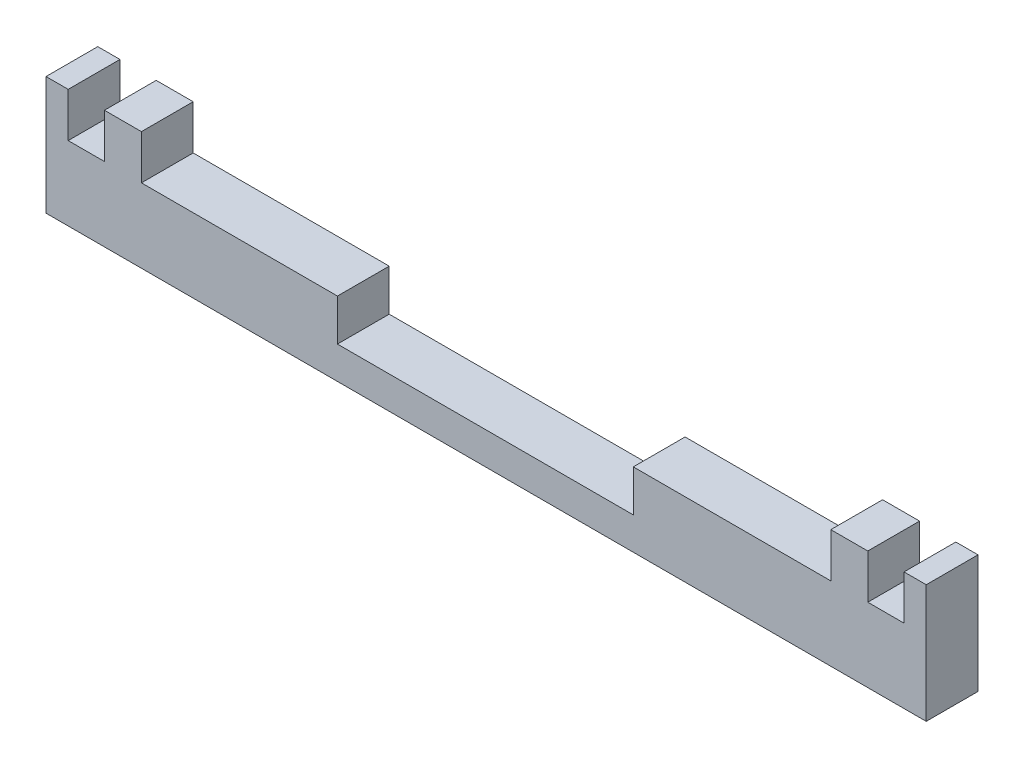
ISO-10303-21;
HEADER;
FILE_DESCRIPTION(('STEP AP214'),'2;1');
FILE_NAME('part.step','',(''),(''),'','','');
FILE_SCHEMA(('AUTOMOTIVE_DESIGN { 1 0 10303 214 1 1 1 1 }'));
ENDSEC;
DATA;
#1=APPLICATION_CONTEXT('core data for automotive mechanical design processes');
#2=APPLICATION_PROTOCOL_DEFINITION('international standard','automotive_design',2000,#1);
#3=PRODUCT_CONTEXT('',#1,'mechanical');
#4=PRODUCT('Part','Part','',(#3));
#5=PRODUCT_RELATED_PRODUCT_CATEGORY('part','',(#4));
#6=PRODUCT_DEFINITION_FORMATION('','',#4);
#7=PRODUCT_DEFINITION_CONTEXT('part definition',#1,'design');
#8=PRODUCT_DEFINITION('design','',#6,#7);
#9=PRODUCT_DEFINITION_SHAPE('','',#8);
#10=(LENGTH_UNIT() NAMED_UNIT(*) SI_UNIT(.MILLI.,.METRE.));
#11=(NAMED_UNIT(*) PLANE_ANGLE_UNIT() SI_UNIT($,.RADIAN.));
#12=(NAMED_UNIT(*) SI_UNIT($,.STERADIAN.) SOLID_ANGLE_UNIT());
#13=UNCERTAINTY_MEASURE_WITH_UNIT(LENGTH_MEASURE(1.E-05),#10,'distance_accuracy_value','');
#14=(GEOMETRIC_REPRESENTATION_CONTEXT(3) GLOBAL_UNCERTAINTY_ASSIGNED_CONTEXT((#13)) GLOBAL_UNIT_ASSIGNED_CONTEXT((#10,
#11,#12)) REPRESENTATION_CONTEXT('',''));
#15=CARTESIAN_POINT('',(0.,0.,0.));
#16=DIRECTION('',(0.,0.,1.));
#17=DIRECTION('',(1.,0.,0.));
#18=AXIS2_PLACEMENT_3D('',#15,#16,#17);
#19=CARTESIAN_POINT('',(39.2998382428941,-10.997149870801,8.89));
#20=DIRECTION('',(0.,-1.,0.));
#21=DIRECTION('',(1.,0.,0.));
#22=AXIS2_PLACEMENT_3D('',#19,#20,#21);
#23=PLANE('',#22);
#24=DIRECTION('',(-1.,0.,0.));
#25=VECTOR('',#24,1.);
#26=CARTESIAN_POINT('',(39.2998382428941,-10.997149870801,8.89));
#27=LINE('',#26,#25);
#28=CARTESIAN_POINT('',(-45.4091617571059,-10.997149870801,8.89));
#29=VERTEX_POINT('',#28);
#30=CARTESIAN_POINT('',(-79.0641617571059,-10.997149870801,8.89));
#31=VERTEX_POINT('',#30);
#32=EDGE_CURVE('E297',#29,#31,#27,.T.);
#33=ORIENTED_EDGE('',*,*,#32,.F.);
#34=DIRECTION('',(0.,0.,1.));
#35=VECTOR('',#34,1.);
#36=CARTESIAN_POINT('',(-45.4091617571059,-10.997149870801,0.));
#37=LINE('',#36,#35);
#38=CARTESIAN_POINT('',(-45.4091617571059,-10.997149870801,0.));
#39=VERTEX_POINT('',#38);
#40=EDGE_CURVE('E197',#39,#29,#37,.T.);
#41=ORIENTED_EDGE('',*,*,#40,.F.);
#42=DIRECTION('',(-1.,0.,0.));
#43=VECTOR('',#42,1.);
#44=CARTESIAN_POINT('',(39.2998382428941,-10.997149870801,0.));
#45=LINE('',#44,#43);
#46=CARTESIAN_POINT('',(-79.0641617571059,-10.997149870801,0.));
#47=VERTEX_POINT('',#46);
#48=EDGE_CURVE('E213',#39,#47,#45,.T.);
#49=ORIENTED_EDGE('',*,*,#48,.T.);
#50=DIRECTION('',(0.,0.,-1.));
#51=VECTOR('',#50,1.);
#52=CARTESIAN_POINT('',(-79.0641617571059,-10.997149870801,8.89));
#53=LINE('',#52,#51);
#54=EDGE_CURVE('E237',#31,#47,#53,.T.);
#55=ORIENTED_EDGE('',*,*,#54,.F.);
#56=EDGE_LOOP('',(#33,#41,#49,#55));
#57=FACE_BOUND('',#56,.T.);
#58=ADVANCED_FACE('F35',(#57),#23,.F.);
#59=CARTESIAN_POINT('',(-95.4471617571059,-3.37714987080102,8.89));
#60=DIRECTION('',(1.,0.,0.));
#61=DIRECTION('',(0.,0.,-1.));
#62=AXIS2_PLACEMENT_3D('',#59,#60,#61);
#63=PLANE('',#62);
#64=DIRECTION('',(0.,-1.,0.));
#65=VECTOR('',#64,1.);
#66=CARTESIAN_POINT('',(-95.4471617571059,-3.37714987080102,0.));
#67=LINE('',#66,#65);
#68=CARTESIAN_POINT('',(-95.4471617571059,-3.37714987080102,0.));
#69=VERTEX_POINT('',#68);
#70=CARTESIAN_POINT('',(-95.4471617571059,-23.697149870801,0.));
#71=VERTEX_POINT('',#70);
#72=EDGE_CURVE('E193',#69,#71,#67,.T.);
#73=ORIENTED_EDGE('',*,*,#72,.T.);
#74=DIRECTION('',(0.,0.,-1.));
#75=VECTOR('',#74,1.);
#76=CARTESIAN_POINT('',(-95.4471617571059,-23.697149870801,8.89));
#77=LINE('',#76,#75);
#78=CARTESIAN_POINT('',(-95.4471617571059,-23.697149870801,8.89));
#79=VERTEX_POINT('',#78);
#80=EDGE_CURVE('E11',#79,#71,#77,.T.);
#81=ORIENTED_EDGE('',*,*,#80,.F.);
#82=DIRECTION('',(0.,-1.,0.));
#83=VECTOR('',#82,1.);
#84=CARTESIAN_POINT('',(-95.4471617571059,-3.37714987080102,8.89));
#85=LINE('',#84,#83);
#86=CARTESIAN_POINT('',(-95.4471617571059,-3.37714987080102,8.89));
#87=VERTEX_POINT('',#86);
#88=EDGE_CURVE('E227',#87,#79,#85,.T.);
#89=ORIENTED_EDGE('',*,*,#88,.F.);
#90=DIRECTION('',(0.,0.,-1.));
#91=VECTOR('',#90,1.);
#92=CARTESIAN_POINT('',(-95.4471617571059,-3.37714987080102,8.89));
#93=LINE('',#92,#91);
#94=EDGE_CURVE('E189',#87,#69,#93,.T.);
#95=ORIENTED_EDGE('',*,*,#94,.T.);
#96=EDGE_LOOP('',(#73,#81,#89,#95));
#97=FACE_BOUND('',#96,.T.);
#98=ADVANCED_FACE('F37',(#97),#63,.F.);
#99=CARTESIAN_POINT('',(-95.4471617571059,-23.697149870801,8.89));
#100=DIRECTION('',(0.,1.,0.));
#101=DIRECTION('',(0.,0.,1.));
#102=AXIS2_PLACEMENT_3D('',#99,#100,#101);
#103=PLANE('',#102);
#104=DIRECTION('',(1.,0.,0.));
#105=VECTOR('',#104,1.);
#106=CARTESIAN_POINT('',(-95.4471617571059,-23.697149870801,0.));
#107=LINE('',#106,#105);
#108=CARTESIAN_POINT('',(55.6828382428941,-23.697149870801,0.));
#109=VERTEX_POINT('',#108);
#110=EDGE_CURVE('E196',#71,#109,#107,.T.);
#111=ORIENTED_EDGE('',*,*,#110,.T.);
#112=DIRECTION('',(0.,0.,-1.));
#113=VECTOR('',#112,1.);
#114=CARTESIAN_POINT('',(55.6828382428941,-23.697149870801,8.89));
#115=LINE('',#114,#113);
#116=CARTESIAN_POINT('',(55.6828382428941,-23.697149870801,8.89));
#117=VERTEX_POINT('',#116);
#118=EDGE_CURVE('E43',#117,#109,#115,.T.);
#119=ORIENTED_EDGE('',*,*,#118,.F.);
#120=DIRECTION('',(1.,0.,0.));
#121=VECTOR('',#120,1.);
#122=CARTESIAN_POINT('',(-95.4471617571059,-23.697149870801,8.89));
#123=LINE('',#122,#121);
#124=EDGE_CURVE('E124',#79,#117,#123,.T.);
#125=ORIENTED_EDGE('',*,*,#124,.F.);
#126=ORIENTED_EDGE('',*,*,#80,.T.);
#127=EDGE_LOOP('',(#111,#119,#125,#126));
#128=FACE_BOUND('',#127,.T.);
#129=ADVANCED_FACE('F405',(#128),#103,.F.);
#130=CARTESIAN_POINT('',(55.6828382428941,-23.697149870801,8.89));
#131=DIRECTION('',(-1.,0.,0.));
#132=DIRECTION('',(0.,-1.,0.));
#133=AXIS2_PLACEMENT_3D('',#130,#131,#132);
#134=PLANE('',#133);
#135=DIRECTION('',(0.,1.,0.));
#136=VECTOR('',#135,1.);
#137=CARTESIAN_POINT('',(55.6828382428941,-23.697149870801,0.));
#138=LINE('',#137,#136);
#139=CARTESIAN_POINT('',(55.6828382428941,-3.377149870801,0.));
#140=VERTEX_POINT('',#139);
#141=EDGE_CURVE('E199',#109,#140,#138,.T.);
#142=ORIENTED_EDGE('',*,*,#141,.T.);
#143=DIRECTION('',(0.,0.,-1.));
#144=VECTOR('',#143,1.);
#145=CARTESIAN_POINT('',(55.6828382428941,-3.377149870801,8.89));
#146=LINE('',#145,#144);
#147=CARTESIAN_POINT('',(55.6828382428941,-3.377149870801,8.89));
#148=VERTEX_POINT('',#147);
#149=EDGE_CURVE('E258',#148,#140,#146,.T.);
#150=ORIENTED_EDGE('',*,*,#149,.F.);
#151=DIRECTION('',(0.,1.,0.));
#152=VECTOR('',#151,1.);
#153=CARTESIAN_POINT('',(55.6828382428941,-23.697149870801,8.89));
#154=LINE('',#153,#152);
#155=EDGE_CURVE('E266',#117,#148,#154,.T.);
#156=ORIENTED_EDGE('',*,*,#155,.F.);
#157=ORIENTED_EDGE('',*,*,#118,.T.);
#158=EDGE_LOOP('',(#142,#150,#156,#157));
#159=FACE_BOUND('',#158,.T.);
#160=ADVANCED_FACE('F264',(#159),#134,.F.);
#161=CARTESIAN_POINT('',(55.6828382428941,-3.377149870801,8.89));
#162=DIRECTION('',(0.,-1.,0.));
#163=DIRECTION('',(1.,0.,0.));
#164=AXIS2_PLACEMENT_3D('',#161,#162,#163);
#165=PLANE('',#164);
#166=DIRECTION('',(-1.,0.,0.));
#167=VECTOR('',#166,1.);
#168=CARTESIAN_POINT('',(55.6828382428941,-3.377149870801,0.));
#169=LINE('',#168,#167);
#170=CARTESIAN_POINT('',(51.8728382428941,-3.377149870801,0.));
#171=VERTEX_POINT('',#170);
#172=EDGE_CURVE('E201',#140,#171,#169,.T.);
#173=ORIENTED_EDGE('',*,*,#172,.T.);
#174=DIRECTION('',(0.,0.,-1.));
#175=VECTOR('',#174,1.);
#176=CARTESIAN_POINT('',(51.8728382428941,-3.377149870801,8.89));
#177=LINE('',#176,#175);
#178=CARTESIAN_POINT('',(51.8728382428941,-3.377149870801,8.89));
#179=VERTEX_POINT('',#178);
#180=EDGE_CURVE('E255',#179,#171,#177,.T.);
#181=ORIENTED_EDGE('',*,*,#180,.F.);
#182=DIRECTION('',(-1.,0.,0.));
#183=VECTOR('',#182,1.);
#184=CARTESIAN_POINT('',(55.6828382428941,-3.377149870801,8.89));
#185=LINE('',#184,#183);
#186=EDGE_CURVE('E285',#148,#179,#185,.T.);
#187=ORIENTED_EDGE('',*,*,#186,.F.);
#188=ORIENTED_EDGE('',*,*,#149,.T.);
#189=EDGE_LOOP('',(#173,#181,#187,#188));
#190=FACE_BOUND('',#189,.T.);
#191=ADVANCED_FACE('F276',(#190),#165,.F.);
#192=CARTESIAN_POINT('',(51.8728382428941,-3.377149870801,8.89));
#193=DIRECTION('',(1.,0.,0.));
#194=DIRECTION('',(0.,1.,0.));
#195=AXIS2_PLACEMENT_3D('',#192,#193,#194);
#196=PLANE('',#195);
#197=DIRECTION('',(0.,-1.,0.));
#198=VECTOR('',#197,1.);
#199=CARTESIAN_POINT('',(51.8728382428941,-3.377149870801,0.));
#200=LINE('',#199,#198);
#201=CARTESIAN_POINT('',(51.872838242894,-10.997149870801,0.));
#202=VERTEX_POINT('',#201);
#203=EDGE_CURVE('E203',#171,#202,#200,.T.);
#204=ORIENTED_EDGE('',*,*,#203,.T.);
#205=DIRECTION('',(0.,0.,-1.));
#206=VECTOR('',#205,1.);
#207=CARTESIAN_POINT('',(51.872838242894,-10.997149870801,8.89));
#208=LINE('',#207,#206);
#209=CARTESIAN_POINT('',(51.872838242894,-10.997149870801,8.89));
#210=VERTEX_POINT('',#209);
#211=EDGE_CURVE('E252',#210,#202,#208,.T.);
#212=ORIENTED_EDGE('',*,*,#211,.F.);
#213=DIRECTION('',(0.,-1.,0.));
#214=VECTOR('',#213,1.);
#215=CARTESIAN_POINT('',(51.8728382428941,-3.377149870801,8.89));
#216=LINE('',#215,#214);
#217=EDGE_CURVE('E282',#179,#210,#216,.T.);
#218=ORIENTED_EDGE('',*,*,#217,.F.);
#219=ORIENTED_EDGE('',*,*,#180,.T.);
#220=EDGE_LOOP('',(#204,#212,#218,#219));
#221=FACE_BOUND('',#220,.T.);
#222=ADVANCED_FACE('F280',(#221),#196,.F.);
#223=CARTESIAN_POINT('',(51.872838242894,-10.997149870801,8.89));
#224=DIRECTION('',(0.,-1.,0.));
#225=DIRECTION('',(1.,0.,0.));
#226=AXIS2_PLACEMENT_3D('',#223,#224,#225);
#227=PLANE('',#226);
#228=DIRECTION('',(-1.,0.,0.));
#229=VECTOR('',#228,1.);
#230=CARTESIAN_POINT('',(51.872838242894,-10.997149870801,0.));
#231=LINE('',#230,#229);
#232=CARTESIAN_POINT('',(45.6498382428941,-10.997149870801,0.));
#233=VERTEX_POINT('',#232);
#234=EDGE_CURVE('E205',#202,#233,#231,.T.);
#235=ORIENTED_EDGE('',*,*,#234,.T.);
#236=DIRECTION('',(0.,0.,-1.));
#237=VECTOR('',#236,1.);
#238=CARTESIAN_POINT('',(45.6498382428941,-10.997149870801,8.89));
#239=LINE('',#238,#237);
#240=CARTESIAN_POINT('',(45.6498382428941,-10.997149870801,8.89));
#241=VERTEX_POINT('',#240);
#242=EDGE_CURVE('E249',#241,#233,#239,.T.);
#243=ORIENTED_EDGE('',*,*,#242,.F.);
#244=DIRECTION('',(-1.,0.,0.));
#245=VECTOR('',#244,1.);
#246=CARTESIAN_POINT('',(51.872838242894,-10.997149870801,8.89));
#247=LINE('',#246,#245);
#248=EDGE_CURVE('E284',#210,#241,#247,.T.);
#249=ORIENTED_EDGE('',*,*,#248,.F.);
#250=ORIENTED_EDGE('',*,*,#211,.T.);
#251=EDGE_LOOP('',(#235,#243,#249,#250));
#252=FACE_BOUND('',#251,.T.);
#253=ADVANCED_FACE('F391',(#252),#227,.F.);
#254=CARTESIAN_POINT('',(45.6498382428941,-10.997149870801,8.89));
#255=DIRECTION('',(-1.,0.,0.));
#256=DIRECTION('',(0.,0.,1.));
#257=AXIS2_PLACEMENT_3D('',#254,#255,#256);
#258=PLANE('',#257);
#259=DIRECTION('',(0.,1.,0.));
#260=VECTOR('',#259,1.);
#261=CARTESIAN_POINT('',(45.6498382428941,-10.997149870801,0.));
#262=LINE('',#261,#260);
#263=CARTESIAN_POINT('',(45.6498382428941,-3.377149870801,0.));
#264=VERTEX_POINT('',#263);
#265=EDGE_CURVE('E207',#233,#264,#262,.T.);
#266=ORIENTED_EDGE('',*,*,#265,.T.);
#267=DIRECTION('',(0.,0.,-1.));
#268=VECTOR('',#267,1.);
#269=CARTESIAN_POINT('',(45.6498382428941,-3.377149870801,8.89));
#270=LINE('',#269,#268);
#271=CARTESIAN_POINT('',(45.6498382428941,-3.377149870801,8.89));
#272=VERTEX_POINT('',#271);
#273=EDGE_CURVE('E246',#272,#264,#270,.T.);
#274=ORIENTED_EDGE('',*,*,#273,.F.);
#275=DIRECTION('',(0.,1.,0.));
#276=VECTOR('',#275,1.);
#277=CARTESIAN_POINT('',(45.6498382428941,-10.997149870801,8.89));
#278=LINE('',#277,#276);
#279=EDGE_CURVE('E287',#241,#272,#278,.T.);
#280=ORIENTED_EDGE('',*,*,#279,.F.);
#281=ORIENTED_EDGE('',*,*,#242,.T.);
#282=EDGE_LOOP('',(#266,#274,#280,#281));
#283=FACE_BOUND('',#282,.T.);
#284=ADVANCED_FACE('F388',(#283),#258,.F.);
#285=CARTESIAN_POINT('',(45.6498382428941,-3.377149870801,8.89));
#286=DIRECTION('',(0.,-1.,0.));
#287=DIRECTION('',(1.,0.,0.));
#288=AXIS2_PLACEMENT_3D('',#285,#286,#287);
#289=PLANE('',#288);
#290=DIRECTION('',(-1.,0.,0.));
#291=VECTOR('',#290,1.);
#292=CARTESIAN_POINT('',(45.6498382428941,-3.377149870801,0.));
#293=LINE('',#292,#291);
#294=CARTESIAN_POINT('',(39.2998382428941,-3.377149870801,0.));
#295=VERTEX_POINT('',#294);
#296=EDGE_CURVE('E209',#264,#295,#293,.T.);
#297=ORIENTED_EDGE('',*,*,#296,.T.);
#298=DIRECTION('',(0.,0.,-1.));
#299=VECTOR('',#298,1.);
#300=CARTESIAN_POINT('',(39.2998382428941,-3.377149870801,8.89));
#301=LINE('',#300,#299);
#302=CARTESIAN_POINT('',(39.2998382428941,-3.377149870801,8.89));
#303=VERTEX_POINT('',#302);
#304=EDGE_CURVE('E243',#303,#295,#301,.T.);
#305=ORIENTED_EDGE('',*,*,#304,.F.);
#306=DIRECTION('',(-1.,0.,0.));
#307=VECTOR('',#306,1.);
#308=CARTESIAN_POINT('',(45.6498382428941,-3.377149870801,8.89));
#309=LINE('',#308,#307);
#310=EDGE_CURVE('E293',#272,#303,#309,.T.);
#311=ORIENTED_EDGE('',*,*,#310,.F.);
#312=ORIENTED_EDGE('',*,*,#273,.T.);
#313=EDGE_LOOP('',(#297,#305,#311,#312));
#314=FACE_BOUND('',#313,.T.);
#315=ADVANCED_FACE('F384',(#314),#289,.F.);
#316=CARTESIAN_POINT('',(39.2998382428941,-3.377149870801,8.89));
#317=DIRECTION('',(1.,0.,0.));
#318=DIRECTION('',(0.,0.,-1.));
#319=AXIS2_PLACEMENT_3D('',#316,#317,#318);
#320=PLANE('',#319);
#321=DIRECTION('',(0.,-1.,0.));
#322=VECTOR('',#321,1.);
#323=CARTESIAN_POINT('',(39.2998382428941,-3.377149870801,0.));
#324=LINE('',#323,#322);
#325=CARTESIAN_POINT('',(39.2998382428941,-10.997149870801,0.));
#326=VERTEX_POINT('',#325);
#327=EDGE_CURVE('E211',#295,#326,#324,.T.);
#328=ORIENTED_EDGE('',*,*,#327,.T.);
#329=DIRECTION('',(0.,0.,-1.));
#330=VECTOR('',#329,1.);
#331=CARTESIAN_POINT('',(39.2998382428941,-10.997149870801,8.89));
#332=LINE('',#331,#330);
#333=CARTESIAN_POINT('',(39.2998382428941,-10.997149870801,8.89));
#334=VERTEX_POINT('',#333);
#335=EDGE_CURVE('E240',#334,#326,#332,.T.);
#336=ORIENTED_EDGE('',*,*,#335,.F.);
#337=DIRECTION('',(0.,-1.,0.));
#338=VECTOR('',#337,1.);
#339=CARTESIAN_POINT('',(39.2998382428941,-3.377149870801,8.89));
#340=LINE('',#339,#338);
#341=EDGE_CURVE('E295',#303,#334,#340,.T.);
#342=ORIENTED_EDGE('',*,*,#341,.F.);
#343=ORIENTED_EDGE('',*,*,#304,.T.);
#344=EDGE_LOOP('',(#328,#336,#342,#343));
#345=FACE_BOUND('',#344,.T.);
#346=ADVANCED_FACE('F379',(#345),#320,.F.);
#347=CARTESIAN_POINT('',(5.39083824289407,-10.997149870801,0.));
#348=VERTEX_POINT('',#347);
#349=EDGE_CURVE('E214',#326,#348,#45,.T.);
#350=ORIENTED_EDGE('',*,*,#349,.T.);
#351=DIRECTION('',(0.,0.,1.));
#352=VECTOR('',#351,1.);
#353=CARTESIAN_POINT('',(5.39083824289407,-10.997149870801,0.));
#354=LINE('',#353,#352);
#355=CARTESIAN_POINT('',(5.39083824289407,-10.997149870801,8.89));
#356=VERTEX_POINT('',#355);
#357=EDGE_CURVE('E326',#348,#356,#354,.T.);
#358=ORIENTED_EDGE('',*,*,#357,.T.);
#359=EDGE_CURVE('E298',#334,#356,#27,.T.);
#360=ORIENTED_EDGE('',*,*,#359,.F.);
#361=ORIENTED_EDGE('',*,*,#335,.T.);
#362=EDGE_LOOP('',(#350,#358,#360,#361));
#363=FACE_BOUND('',#362,.T.);
#364=ADVANCED_FACE('F372',(#363),#23,.F.);
#365=CARTESIAN_POINT('',(-79.0641617571059,-10.997149870801,8.89));
#366=DIRECTION('',(-1.,0.,0.));
#367=DIRECTION('',(0.,0.,1.));
#368=AXIS2_PLACEMENT_3D('',#365,#366,#367);
#369=PLANE('',#368);
#370=DIRECTION('',(0.,1.,0.));
#371=VECTOR('',#370,1.);
#372=CARTESIAN_POINT('',(-79.0641617571059,-10.997149870801,0.));
#373=LINE('',#372,#371);
#374=CARTESIAN_POINT('',(-79.0641617571059,-3.37714987080101,0.));
#375=VERTEX_POINT('',#374);
#376=EDGE_CURVE('E217',#47,#375,#373,.T.);
#377=ORIENTED_EDGE('',*,*,#376,.T.);
#378=DIRECTION('',(0.,0.,-1.));
#379=VECTOR('',#378,1.);
#380=CARTESIAN_POINT('',(-79.0641617571059,-3.37714987080101,8.89));
#381=LINE('',#380,#379);
#382=CARTESIAN_POINT('',(-79.0641617571059,-3.37714987080101,8.89));
#383=VERTEX_POINT('',#382);
#384=EDGE_CURVE('E234',#383,#375,#381,.T.);
#385=ORIENTED_EDGE('',*,*,#384,.F.);
#386=DIRECTION('',(0.,1.,0.));
#387=VECTOR('',#386,1.);
#388=CARTESIAN_POINT('',(-79.0641617571059,-10.997149870801,8.89));
#389=LINE('',#388,#387);
#390=EDGE_CURVE('E301',#31,#383,#389,.T.);
#391=ORIENTED_EDGE('',*,*,#390,.F.);
#392=ORIENTED_EDGE('',*,*,#54,.T.);
#393=EDGE_LOOP('',(#377,#385,#391,#392));
#394=FACE_BOUND('',#393,.T.);
#395=ADVANCED_FACE('F409',(#394),#369,.F.);
#396=CARTESIAN_POINT('',(-79.0641617571059,-3.37714987080101,8.89));
#397=DIRECTION('',(0.,-1.,0.));
#398=DIRECTION('',(1.,0.,0.));
#399=AXIS2_PLACEMENT_3D('',#396,#397,#398);
#400=PLANE('',#399);
#401=DIRECTION('',(-1.,0.,0.));
#402=VECTOR('',#401,1.);
#403=CARTESIAN_POINT('',(-79.0641617571059,-3.37714987080101,0.));
#404=LINE('',#403,#402);
#405=CARTESIAN_POINT('',(-85.4141617571059,-3.37714987080101,0.));
#406=VERTEX_POINT('',#405);
#407=EDGE_CURVE('E219',#375,#406,#404,.T.);
#408=ORIENTED_EDGE('',*,*,#407,.T.);
#409=DIRECTION('',(0.,0.,-1.));
#410=VECTOR('',#409,1.);
#411=CARTESIAN_POINT('',(-85.4141617571059,-3.37714987080101,8.89));
#412=LINE('',#411,#410);
#413=CARTESIAN_POINT('',(-85.4141617571059,-3.37714987080101,8.89));
#414=VERTEX_POINT('',#413);
#415=EDGE_CURVE('E231',#414,#406,#412,.T.);
#416=ORIENTED_EDGE('',*,*,#415,.F.);
#417=DIRECTION('',(-1.,0.,0.));
#418=VECTOR('',#417,1.);
#419=CARTESIAN_POINT('',(-79.0641617571059,-3.37714987080101,8.89));
#420=LINE('',#419,#418);
#421=EDGE_CURVE('E303',#383,#414,#420,.T.);
#422=ORIENTED_EDGE('',*,*,#421,.F.);
#423=ORIENTED_EDGE('',*,*,#384,.T.);
#424=EDGE_LOOP('',(#408,#416,#422,#423));
#425=FACE_BOUND('',#424,.T.);
#426=ADVANCED_FACE('F309',(#425),#400,.F.);
#427=CARTESIAN_POINT('',(-85.4141617571059,-3.37714987080101,8.89));
#428=DIRECTION('',(1.,0.,0.));
#429=DIRECTION('',(0.,0.,-1.));
#430=AXIS2_PLACEMENT_3D('',#427,#428,#429);
#431=PLANE('',#430);
#432=DIRECTION('',(0.,-1.,0.));
#433=VECTOR('',#432,1.);
#434=CARTESIAN_POINT('',(-85.4141617571059,-3.37714987080101,0.));
#435=LINE('',#434,#433);
#436=CARTESIAN_POINT('',(-85.4141617571059,-10.997149870801,0.));
#437=VERTEX_POINT('',#436);
#438=EDGE_CURVE('E221',#406,#437,#435,.T.);
#439=ORIENTED_EDGE('',*,*,#438,.T.);
#440=DIRECTION('',(0.,0.,-1.));
#441=VECTOR('',#440,1.);
#442=CARTESIAN_POINT('',(-85.4141617571059,-10.997149870801,8.89));
#443=LINE('',#442,#441);
#444=CARTESIAN_POINT('',(-85.4141617571059,-10.997149870801,8.89));
#445=VERTEX_POINT('',#444);
#446=EDGE_CURVE('E184',#445,#437,#443,.T.);
#447=ORIENTED_EDGE('',*,*,#446,.F.);
#448=DIRECTION('',(0.,-1.,0.));
#449=VECTOR('',#448,1.);
#450=CARTESIAN_POINT('',(-85.4141617571059,-3.37714987080101,8.89));
#451=LINE('',#450,#449);
#452=EDGE_CURVE('E172',#414,#445,#451,.T.);
#453=ORIENTED_EDGE('',*,*,#452,.F.);
#454=ORIENTED_EDGE('',*,*,#415,.T.);
#455=EDGE_LOOP('',(#439,#447,#453,#454));
#456=FACE_BOUND('',#455,.T.);
#457=ADVANCED_FACE('F313',(#456),#431,.F.);
#458=CARTESIAN_POINT('',(-85.4141617571059,-10.997149870801,8.89));
#459=DIRECTION('',(0.,-1.,0.));
#460=DIRECTION('',(1.,0.,0.));
#461=AXIS2_PLACEMENT_3D('',#458,#459,#460);
#462=PLANE('',#461);
#463=DIRECTION('',(-1.,0.,0.));
#464=VECTOR('',#463,1.);
#465=CARTESIAN_POINT('',(-85.4141617571059,-10.997149870801,0.));
#466=LINE('',#465,#464);
#467=CARTESIAN_POINT('',(-91.6371617571059,-10.997149870801,0.));
#468=VERTEX_POINT('',#467);
#469=EDGE_CURVE('E181',#437,#468,#466,.T.);
#470=ORIENTED_EDGE('',*,*,#469,.T.);
#471=DIRECTION('',(0.,0.,-1.));
#472=VECTOR('',#471,1.);
#473=CARTESIAN_POINT('',(-91.6371617571059,-10.997149870801,8.89));
#474=LINE('',#473,#472);
#475=CARTESIAN_POINT('',(-91.6371617571059,-10.997149870801,8.89));
#476=VERTEX_POINT('',#475);
#477=EDGE_CURVE('E178',#476,#468,#474,.T.);
#478=ORIENTED_EDGE('',*,*,#477,.F.);
#479=DIRECTION('',(-1.,0.,0.));
#480=VECTOR('',#479,1.);
#481=CARTESIAN_POINT('',(-85.4141617571059,-10.997149870801,8.89));
#482=LINE('',#481,#480);
#483=EDGE_CURVE('E164',#445,#476,#482,.T.);
#484=ORIENTED_EDGE('',*,*,#483,.F.);
#485=ORIENTED_EDGE('',*,*,#446,.T.);
#486=EDGE_LOOP('',(#470,#478,#484,#485));
#487=FACE_BOUND('',#486,.T.);
#488=ADVANCED_FACE('F179',(#487),#462,.F.);
#489=CARTESIAN_POINT('',(-91.6371617571059,-10.997149870801,8.89));
#490=DIRECTION('',(-1.,0.,0.));
#491=DIRECTION('',(0.,0.,1.));
#492=AXIS2_PLACEMENT_3D('',#489,#490,#491);
#493=PLANE('',#492);
#494=DIRECTION('',(0.,1.,0.));
#495=VECTOR('',#494,1.);
#496=CARTESIAN_POINT('',(-91.6371617571059,-10.997149870801,0.));
#497=LINE('',#496,#495);
#498=CARTESIAN_POINT('',(-91.6371617571059,-3.37714987080101,0.));
#499=VERTEX_POINT('',#498);
#500=EDGE_CURVE('E224',#468,#499,#497,.T.);
#501=ORIENTED_EDGE('',*,*,#500,.T.);
#502=DIRECTION('',(0.,0.,-1.));
#503=VECTOR('',#502,1.);
#504=CARTESIAN_POINT('',(-91.6371617571059,-3.37714987080101,8.89));
#505=LINE('',#504,#503);
#506=CARTESIAN_POINT('',(-91.6371617571059,-3.37714987080101,8.89));
#507=VERTEX_POINT('',#506);
#508=EDGE_CURVE('E185',#507,#499,#505,.T.);
#509=ORIENTED_EDGE('',*,*,#508,.F.);
#510=DIRECTION('',(0.,1.,0.));
#511=VECTOR('',#510,1.);
#512=CARTESIAN_POINT('',(-91.6371617571059,-10.997149870801,8.89));
#513=LINE('',#512,#511);
#514=EDGE_CURVE('E169',#476,#507,#513,.T.);
#515=ORIENTED_EDGE('',*,*,#514,.F.);
#516=ORIENTED_EDGE('',*,*,#477,.T.);
#517=EDGE_LOOP('',(#501,#509,#515,#516));
#518=FACE_BOUND('',#517,.T.);
#519=ADVANCED_FACE('F187',(#518),#493,.F.);
#520=CARTESIAN_POINT('',(-91.6371617571059,-3.37714987080101,8.89));
#521=DIRECTION('',(0.,-1.,0.));
#522=DIRECTION('',(1.,0.,0.));
#523=AXIS2_PLACEMENT_3D('',#520,#521,#522);
#524=PLANE('',#523);
#525=DIRECTION('',(-1.,0.,0.));
#526=VECTOR('',#525,1.);
#527=CARTESIAN_POINT('',(-91.6371617571059,-3.37714987080101,0.));
#528=LINE('',#527,#526);
#529=EDGE_CURVE('E116',#499,#69,#528,.T.);
#530=ORIENTED_EDGE('',*,*,#529,.T.);
#531=ORIENTED_EDGE('',*,*,#94,.F.);
#532=DIRECTION('',(-1.,0.,0.));
#533=VECTOR('',#532,1.);
#534=CARTESIAN_POINT('',(-91.6371617571059,-3.37714987080101,8.89));
#535=LINE('',#534,#533);
#536=EDGE_CURVE('E59',#507,#87,#535,.T.);
#537=ORIENTED_EDGE('',*,*,#536,.F.);
#538=ORIENTED_EDGE('',*,*,#508,.T.);
#539=EDGE_LOOP('',(#530,#531,#537,#538));
#540=FACE_BOUND('',#539,.T.);
#541=ADVANCED_FACE('F314',(#540),#524,.F.);
#542=CARTESIAN_POINT('',(0.,0.,8.89));
#543=DIRECTION('',(0.,0.,1.));
#544=DIRECTION('',(1.,0.,0.));
#545=AXIS2_PLACEMENT_3D('',#542,#543,#544);
#546=PLANE('',#545);
#547=DIRECTION('',(0.,-1.,0.));
#548=VECTOR('',#547,1.);
#549=CARTESIAN_POINT('',(-45.4091617571059,-10.997149870801,8.89));
#550=LINE('',#549,#548);
#551=CARTESIAN_POINT('',(-45.4091617571059,-18.140899870801,8.89));
#552=VERTEX_POINT('',#551);
#553=EDGE_CURVE('E338',#29,#552,#550,.T.);
#554=ORIENTED_EDGE('',*,*,#553,.F.);
#555=ORIENTED_EDGE('',*,*,#32,.T.);
#556=ORIENTED_EDGE('',*,*,#390,.T.);
#557=ORIENTED_EDGE('',*,*,#421,.T.);
#558=ORIENTED_EDGE('',*,*,#452,.T.);
#559=ORIENTED_EDGE('',*,*,#483,.T.);
#560=ORIENTED_EDGE('',*,*,#514,.T.);
#561=ORIENTED_EDGE('',*,*,#536,.T.);
#562=ORIENTED_EDGE('',*,*,#88,.T.);
#563=ORIENTED_EDGE('',*,*,#124,.T.);
#564=ORIENTED_EDGE('',*,*,#155,.T.);
#565=ORIENTED_EDGE('',*,*,#186,.T.);
#566=ORIENTED_EDGE('',*,*,#217,.T.);
#567=ORIENTED_EDGE('',*,*,#248,.T.);
#568=ORIENTED_EDGE('',*,*,#279,.T.);
#569=ORIENTED_EDGE('',*,*,#310,.T.);
#570=ORIENTED_EDGE('',*,*,#341,.T.);
#571=ORIENTED_EDGE('',*,*,#359,.T.);
#572=DIRECTION('',(0.,1.,0.));
#573=VECTOR('',#572,1.);
#574=CARTESIAN_POINT('',(5.39083824289407,-10.997149870801,8.89));
#575=LINE('',#574,#573);
#576=CARTESIAN_POINT('',(5.39083824289407,-18.140899870801,8.89));
#577=VERTEX_POINT('',#576);
#578=EDGE_CURVE('E331',#577,#356,#575,.T.);
#579=ORIENTED_EDGE('',*,*,#578,.F.);
#580=DIRECTION('',(1.,0.,0.));
#581=VECTOR('',#580,1.);
#582=CARTESIAN_POINT('',(-45.4091617571059,-18.140899870801,8.89));
#583=LINE('',#582,#581);
#584=EDGE_CURVE('E335',#552,#577,#583,.T.);
#585=ORIENTED_EDGE('',*,*,#584,.F.);
#586=EDGE_LOOP('',(#554,#555,#556,#557,#558,#559,#560,#561,#562,#563,#564,#565,#566,#567,#568,
#569,#570,#571,#579,#585));
#587=FACE_BOUND('',#586,.T.);
#588=ADVANCED_FACE('F167',(#587),#546,.T.);
#589=CARTESIAN_POINT('',(0.,0.,0.));
#590=DIRECTION('',(0.,0.,1.));
#591=DIRECTION('',(1.,0.,0.));
#592=AXIS2_PLACEMENT_3D('',#589,#590,#591);
#593=PLANE('',#592);
#594=ORIENTED_EDGE('',*,*,#48,.F.);
#595=DIRECTION('',(0.,-1.,0.));
#596=VECTOR('',#595,1.);
#597=CARTESIAN_POINT('',(-45.4091617571059,-10.997149870801,0.));
#598=LINE('',#597,#596);
#599=CARTESIAN_POINT('',(-45.4091617571059,-18.140899870801,0.));
#600=VERTEX_POINT('',#599);
#601=EDGE_CURVE('E334',#39,#600,#598,.T.);
#602=ORIENTED_EDGE('',*,*,#601,.T.);
#603=DIRECTION('',(1.,0.,0.));
#604=VECTOR('',#603,1.);
#605=CARTESIAN_POINT('',(-45.4091617571059,-18.140899870801,0.));
#606=LINE('',#605,#604);
#607=CARTESIAN_POINT('',(5.39083824289407,-18.140899870801,0.));
#608=VERTEX_POINT('',#607);
#609=EDGE_CURVE('E342',#600,#608,#606,.T.);
#610=ORIENTED_EDGE('',*,*,#609,.T.);
#611=DIRECTION('',(0.,1.,0.));
#612=VECTOR('',#611,1.);
#613=CARTESIAN_POINT('',(5.39083824289407,-10.997149870801,0.));
#614=LINE('',#613,#612);
#615=EDGE_CURVE('E50',#608,#348,#614,.T.);
#616=ORIENTED_EDGE('',*,*,#615,.T.);
#617=ORIENTED_EDGE('',*,*,#349,.F.);
#618=ORIENTED_EDGE('',*,*,#327,.F.);
#619=ORIENTED_EDGE('',*,*,#296,.F.);
#620=ORIENTED_EDGE('',*,*,#265,.F.);
#621=ORIENTED_EDGE('',*,*,#234,.F.);
#622=ORIENTED_EDGE('',*,*,#203,.F.);
#623=ORIENTED_EDGE('',*,*,#172,.F.);
#624=ORIENTED_EDGE('',*,*,#141,.F.);
#625=ORIENTED_EDGE('',*,*,#110,.F.);
#626=ORIENTED_EDGE('',*,*,#72,.F.);
#627=ORIENTED_EDGE('',*,*,#529,.F.);
#628=ORIENTED_EDGE('',*,*,#500,.F.);
#629=ORIENTED_EDGE('',*,*,#469,.F.);
#630=ORIENTED_EDGE('',*,*,#438,.F.);
#631=ORIENTED_EDGE('',*,*,#407,.F.);
#632=ORIENTED_EDGE('',*,*,#376,.F.);
#633=EDGE_LOOP('',(#594,#602,#610,#616,#617,#618,#619,#620,#621,#622,#623,#624,#625,#626,#627,
#628,#629,#630,#631,#632));
#634=FACE_BOUND('',#633,.T.);
#635=ADVANCED_FACE('F270',(#634),#593,.F.);
#636=CARTESIAN_POINT('',(-45.4091617571059,-10.997149870801,0.));
#637=DIRECTION('',(-1.,0.,0.));
#638=DIRECTION('',(0.,0.,1.));
#639=AXIS2_PLACEMENT_3D('',#636,#637,#638);
#640=PLANE('',#639);
#641=ORIENTED_EDGE('',*,*,#553,.T.);
#642=DIRECTION('',(0.,0.,1.));
#643=VECTOR('',#642,1.);
#644=CARTESIAN_POINT('',(-45.4091617571059,-18.140899870801,0.));
#645=LINE('',#644,#643);
#646=EDGE_CURVE('E321',#600,#552,#645,.T.);
#647=ORIENTED_EDGE('',*,*,#646,.F.);
#648=ORIENTED_EDGE('',*,*,#601,.F.);
#649=ORIENTED_EDGE('',*,*,#40,.T.);
#650=EDGE_LOOP('',(#641,#647,#648,#649));
#651=FACE_BOUND('',#650,.T.);
#652=ADVANCED_FACE('F355',(#651),#640,.F.);
#653=CARTESIAN_POINT('',(5.39083824289407,-10.997149870801,0.));
#654=DIRECTION('',(1.,0.,0.));
#655=DIRECTION('',(0.,0.,-1.));
#656=AXIS2_PLACEMENT_3D('',#653,#654,#655);
#657=PLANE('',#656);
#658=ORIENTED_EDGE('',*,*,#578,.T.);
#659=ORIENTED_EDGE('',*,*,#357,.F.);
#660=ORIENTED_EDGE('',*,*,#615,.F.);
#661=DIRECTION('',(0.,0.,1.));
#662=VECTOR('',#661,1.);
#663=CARTESIAN_POINT('',(5.39083824289407,-18.140899870801,0.));
#664=LINE('',#663,#662);
#665=EDGE_CURVE('E324',#608,#577,#664,.T.);
#666=ORIENTED_EDGE('',*,*,#665,.T.);
#667=EDGE_LOOP('',(#658,#659,#660,#666));
#668=FACE_BOUND('',#667,.T.);
#669=ADVANCED_FACE('F369',(#668),#657,.F.);
#670=CARTESIAN_POINT('',(-45.4091617571059,-18.140899870801,0.));
#671=DIRECTION('',(0.,-1.,0.));
#672=DIRECTION('',(1.,0.,0.));
#673=AXIS2_PLACEMENT_3D('',#670,#671,#672);
#674=PLANE('',#673);
#675=ORIENTED_EDGE('',*,*,#584,.T.);
#676=ORIENTED_EDGE('',*,*,#665,.F.);
#677=ORIENTED_EDGE('',*,*,#609,.F.);
#678=ORIENTED_EDGE('',*,*,#646,.T.);
#679=EDGE_LOOP('',(#675,#676,#677,#678));
#680=FACE_BOUND('',#679,.T.);
#681=ADVANCED_FACE('F549',(#680),#674,.F.);
#682=CLOSED_SHELL('',(#58,#98,#129,#160,#191,#222,#253,#284,#315,#346,#364,#395,#426,#457,#488,
#519,#541,#588,#635,#652,#669,#681));
#683=MANIFOLD_SOLID_BREP('B2',#682);
#684=ADVANCED_BREP_SHAPE_REPRESENTATION('',(#18,#683),#14);
#685=SHAPE_DEFINITION_REPRESENTATION(#9,#684);
ENDSEC;
END-ISO-10303-21;
